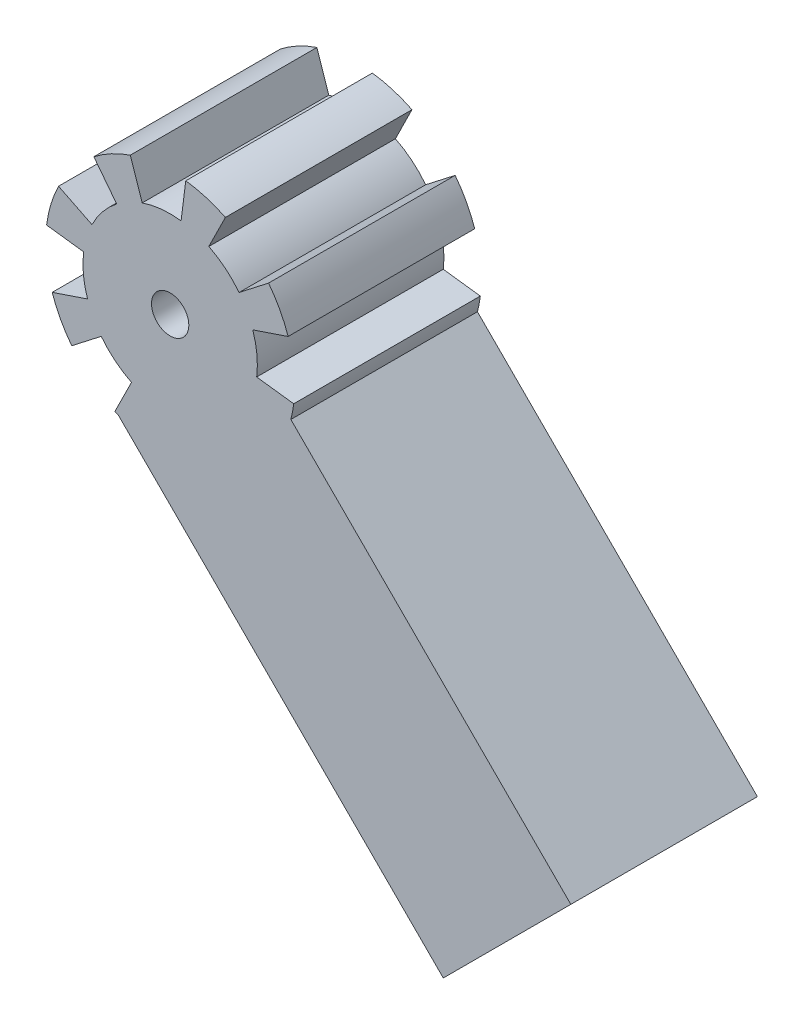
ISO-10303-21;
HEADER;
FILE_DESCRIPTION(('STEP AP214'),'2;1');
FILE_NAME('part.step','',(''),(''),'','','');
FILE_SCHEMA(('AUTOMOTIVE_DESIGN { 1 0 10303 214 1 1 1 1 }'));
ENDSEC;
DATA;
#1=APPLICATION_CONTEXT('core data for automotive mechanical design processes');
#2=APPLICATION_PROTOCOL_DEFINITION('international standard','automotive_design',2000,#1);
#3=PRODUCT_CONTEXT('',#1,'mechanical');
#4=PRODUCT('Part','Part','',(#3));
#5=PRODUCT_RELATED_PRODUCT_CATEGORY('part','',(#4));
#6=PRODUCT_DEFINITION_FORMATION('','',#4);
#7=PRODUCT_DEFINITION_CONTEXT('part definition',#1,'design');
#8=PRODUCT_DEFINITION('design','',#6,#7);
#9=PRODUCT_DEFINITION_SHAPE('','',#8);
#10=(LENGTH_UNIT() NAMED_UNIT(*) SI_UNIT(.MILLI.,.METRE.));
#11=(NAMED_UNIT(*) PLANE_ANGLE_UNIT() SI_UNIT($,.RADIAN.));
#12=(NAMED_UNIT(*) SI_UNIT($,.STERADIAN.) SOLID_ANGLE_UNIT());
#13=UNCERTAINTY_MEASURE_WITH_UNIT(LENGTH_MEASURE(1.E-05),#10,'distance_accuracy_value','');
#14=(GEOMETRIC_REPRESENTATION_CONTEXT(3) GLOBAL_UNCERTAINTY_ASSIGNED_CONTEXT((#13)) GLOBAL_UNIT_ASSIGNED_CONTEXT((#10,
#11,#12)) REPRESENTATION_CONTEXT('',''));
#15=CARTESIAN_POINT('',(0.,0.,0.));
#16=DIRECTION('',(0.,0.,1.));
#17=DIRECTION('',(1.,0.,0.));
#18=AXIS2_PLACEMENT_3D('',#15,#16,#17);
#19=CARTESIAN_POINT('',(-60.6023626185758,34.350667157932,20.));
#20=DIRECTION('',(0.,0.,-1.));
#21=DIRECTION('',(-1.,0.,0.));
#22=AXIS2_PLACEMENT_3D('',#19,#20,#21);
#23=CYLINDRICAL_SURFACE('',#22,13.3482298663582);
#24=DIRECTION('',(0.,0.,-1.));
#25=VECTOR('',#24,1.);
#26=CARTESIAN_POINT('',(-71.1495577414688,26.1694743595218,130.932125188069));
#27=LINE('',#26,#25);
#28=CARTESIAN_POINT('',(-71.1495577414688,26.1694743595218,20.));
#29=VERTEX_POINT('',#28);
#30=CARTESIAN_POINT('',(-71.1495577414688,26.1694743595218,0.));
#31=VERTEX_POINT('',#30);
#32=EDGE_CURVE('E50',#29,#31,#27,.T.);
#33=ORIENTED_EDGE('',*,*,#32,.F.);
#34=CARTESIAN_POINT('',(-60.6023626185758,34.350667157932,20.));
#35=DIRECTION('',(0.,0.,1.));
#36=DIRECTION('',(1.,0.,0.));
#37=AXIS2_PLACEMENT_3D('',#34,#35,#36);
#38=CIRCLE('',#37,13.3482298663582);
#39=CARTESIAN_POINT('',(-73.2476884215612,30.0762109467296,20.));
#40=VERTEX_POINT('',#39);
#41=EDGE_CURVE('E242',#40,#29,#38,.T.);
#42=ORIENTED_EDGE('',*,*,#41,.F.);
#43=DIRECTION('',(0.,0.,-1.));
#44=VECTOR('',#43,1.);
#45=CARTESIAN_POINT('',(-73.2476884215612,30.0762109467296,131.019410858415));
#46=LINE('',#45,#44);
#47=CARTESIAN_POINT('',(-73.2476884215612,30.0762109467296,0.));
#48=VERTEX_POINT('',#47);
#49=EDGE_CURVE('E255',#40,#48,#46,.T.);
#50=ORIENTED_EDGE('',*,*,#49,.T.);
#51=CARTESIAN_POINT('',(-60.6023626185758,34.350667157932,0.));
#52=DIRECTION('',(0.,0.,1.));
#53=DIRECTION('',(1.,0.,0.));
#54=AXIS2_PLACEMENT_3D('',#51,#52,#53);
#55=CIRCLE('',#54,13.3482298663582);
#56=EDGE_CURVE('E463',#48,#31,#55,.T.);
#57=ORIENTED_EDGE('',*,*,#56,.T.);
#58=EDGE_LOOP('',(#33,#42,#50,#57));
#59=FACE_BOUND('',#58,.T.);
#60=ADVANCED_FACE('F35',(#59),#23,.T.);
#61=DIRECTION('',(0.,0.,-1.));
#62=VECTOR('',#61,1.);
#63=CARTESIAN_POINT('',(-73.8453327184215,36.0236834458769,131.019410858415));
#64=LINE('',#63,#62);
#65=CARTESIAN_POINT('',(-73.8453327184215,36.0236834458769,20.));
#66=VERTEX_POINT('',#65);
#67=CARTESIAN_POINT('',(-73.8453327184215,36.0236834458769,0.));
#68=VERTEX_POINT('',#67);
#69=EDGE_CURVE('E58',#66,#68,#64,.T.);
#70=ORIENTED_EDGE('',*,*,#69,.F.);
#71=CARTESIAN_POINT('',(-72.5664552170062,40.26976581071,20.));
#72=VERTEX_POINT('',#71);
#73=EDGE_CURVE('E351',#72,#66,#38,.T.);
#74=ORIENTED_EDGE('',*,*,#73,.F.);
#75=DIRECTION('',(0.,0.,-1.));
#76=VECTOR('',#75,1.);
#77=CARTESIAN_POINT('',(-72.5664552170062,40.26976581071,106.112845736607));
#78=LINE('',#77,#76);
#79=CARTESIAN_POINT('',(-72.5664552170062,40.26976581071,0.));
#80=VERTEX_POINT('',#79);
#81=EDGE_CURVE('E328',#72,#80,#78,.T.);
#82=ORIENTED_EDGE('',*,*,#81,.T.);
#83=EDGE_CURVE('E367',#80,#68,#55,.T.);
#84=ORIENTED_EDGE('',*,*,#83,.T.);
#85=EDGE_LOOP('',(#70,#74,#82,#84));
#86=FACE_BOUND('',#85,.T.);
#87=ADVANCED_FACE('F502',(#86),#23,.T.);
#88=DIRECTION('',(0.,0.,-1.));
#89=VECTOR('',#88,1.);
#90=CARTESIAN_POINT('',(-47.3593925187301,32.677650869987,131.112845736608));
#91=LINE('',#90,#89);
#92=CARTESIAN_POINT('',(-47.3593925187301,32.677650869987,20.));
#93=VERTEX_POINT('',#92);
#94=CARTESIAN_POINT('',(-47.3593925187301,32.677650869987,0.));
#95=VERTEX_POINT('',#94);
#96=EDGE_CURVE('E266',#93,#95,#91,.T.);
#97=ORIENTED_EDGE('',*,*,#96,.F.);
#98=CARTESIAN_POINT('',(-47.6643117264083,31.067059435195,20.));
#99=VERTEX_POINT('',#98);
#100=EDGE_CURVE('E346',#99,#93,#38,.T.);
#101=ORIENTED_EDGE('',*,*,#100,.F.);
#102=DIRECTION('',(0.,0.,-1.));
#103=VECTOR('',#102,1.);
#104=CARTESIAN_POINT('',(-47.6643117264083,31.067059435195,20.));
#105=LINE('',#104,#103);
#106=CARTESIAN_POINT('',(-47.6643117264083,31.067059435195,0.));
#107=VERTEX_POINT('',#106);
#108=EDGE_CURVE('E358',#99,#107,#105,.T.);
#109=ORIENTED_EDGE('',*,*,#108,.T.);
#110=EDGE_CURVE('E362',#107,#95,#55,.T.);
#111=ORIENTED_EDGE('',*,*,#110,.T.);
#112=EDGE_LOOP('',(#97,#101,#109,#111));
#113=FACE_BOUND('',#112,.T.);
#114=ADVANCED_FACE('F506',(#113),#23,.T.);
#115=CARTESIAN_POINT('',(-47.9570368155904,38.6251233691344,20.));
#116=VERTEX_POINT('',#115);
#117=CARTESIAN_POINT('',(-50.0551674956828,42.5318599563421,20.));
#118=VERTEX_POINT('',#117);
#119=EDGE_CURVE('E350',#116,#118,#38,.T.);
#120=ORIENTED_EDGE('',*,*,#119,.F.);
#121=DIRECTION('',(0.,0.,-1.));
#122=VECTOR('',#121,1.);
#123=CARTESIAN_POINT('',(-47.9570368155904,38.6251233691344,131.112845736608));
#124=LINE('',#123,#122);
#125=CARTESIAN_POINT('',(-47.9570368155904,38.6251233691344,0.));
#126=VERTEX_POINT('',#125);
#127=EDGE_CURVE('E272',#116,#126,#124,.T.);
#128=ORIENTED_EDGE('',*,*,#127,.T.);
#129=CARTESIAN_POINT('',(-50.0551674956828,42.5318599563421,0.));
#130=VERTEX_POINT('',#129);
#131=EDGE_CURVE('E366',#126,#130,#55,.T.);
#132=ORIENTED_EDGE('',*,*,#131,.T.);
#133=DIRECTION('',(0.,0.,-1.));
#134=VECTOR('',#133,1.);
#135=CARTESIAN_POINT('',(-50.0551674956828,42.5318599563421,131.112845736608));
#136=LINE('',#135,#134);
#137=EDGE_CURVE('E283',#118,#130,#136,.T.);
#138=ORIENTED_EDGE('',*,*,#137,.F.);
#139=EDGE_LOOP('',(#120,#128,#132,#138));
#140=FACE_BOUND('',#139,.T.);
#141=ADVANCED_FACE('F470',(#140),#23,.T.);
#142=CARTESIAN_POINT('',(-54.6832639657977,46.3147597563624,20.));
#143=VERTEX_POINT('',#142);
#144=CARTESIAN_POINT('',(-58.9293463306309,47.5936372577777,20.));
#145=VERTEX_POINT('',#144);
#146=EDGE_CURVE('E441',#143,#145,#38,.T.);
#147=ORIENTED_EDGE('',*,*,#146,.F.);
#148=DIRECTION('',(0.,0.,-1.));
#149=VECTOR('',#148,1.);
#150=CARTESIAN_POINT('',(-54.6832639657977,46.3147597563624,131.112845736608));
#151=LINE('',#150,#149);
#152=CARTESIAN_POINT('',(-54.6832639657977,46.3147597563624,0.));
#153=VERTEX_POINT('',#152);
#154=EDGE_CURVE('E290',#143,#153,#151,.T.);
#155=ORIENTED_EDGE('',*,*,#154,.T.);
#156=CARTESIAN_POINT('',(-58.9293463306309,47.5936372577777,0.));
#157=VERTEX_POINT('',#156);
#158=EDGE_CURVE('E461',#153,#157,#55,.T.);
#159=ORIENTED_EDGE('',*,*,#158,.T.);
#160=DIRECTION('',(0.,0.,-1.));
#161=VECTOR('',#160,1.);
#162=CARTESIAN_POINT('',(-58.9293463306309,47.5936372577777,131.112845736608));
#163=LINE('',#162,#161);
#164=EDGE_CURVE('E302',#145,#157,#163,.T.);
#165=ORIENTED_EDGE('',*,*,#164,.F.);
#166=EDGE_LOOP('',(#147,#155,#159,#165));
#167=FACE_BOUND('',#166,.T.);
#168=ADVANCED_FACE('F483',(#167),#23,.T.);
#169=CARTESIAN_POINT('',(-64.8768188297782,46.9959929609174,20.));
#170=VERTEX_POINT('',#169);
#171=CARTESIAN_POINT('',(-68.783555416986,44.897862280825,20.));
#172=VERTEX_POINT('',#171);
#173=EDGE_CURVE('E440',#170,#172,#38,.T.);
#174=ORIENTED_EDGE('',*,*,#173,.F.);
#175=DIRECTION('',(0.,0.,-1.));
#176=VECTOR('',#175,1.);
#177=CARTESIAN_POINT('',(-64.8768188297782,46.9959929609174,131.112845736608));
#178=LINE('',#177,#176);
#179=CARTESIAN_POINT('',(-64.8768188297782,46.9959929609174,0.));
#180=VERTEX_POINT('',#179);
#181=EDGE_CURVE('E309',#170,#180,#178,.T.);
#182=ORIENTED_EDGE('',*,*,#181,.T.);
#183=CARTESIAN_POINT('',(-68.783555416986,44.897862280825,0.));
#184=VERTEX_POINT('',#183);
#185=EDGE_CURVE('E460',#180,#184,#55,.T.);
#186=ORIENTED_EDGE('',*,*,#185,.T.);
#187=DIRECTION('',(0.,0.,-1.));
#188=VECTOR('',#187,1.);
#189=CARTESIAN_POINT('',(-68.783555416986,44.897862280825,106.112845736607));
#190=LINE('',#189,#188);
#191=EDGE_CURVE('E321',#172,#184,#190,.T.);
#192=ORIENTED_EDGE('',*,*,#191,.F.);
#193=EDGE_LOOP('',(#174,#182,#186,#192));
#194=FACE_BOUND('',#193,.T.);
#195=ADVANCED_FACE('F458',(#194),#23,.T.);
#196=CARTESIAN_POINT('',(-66.5214612713538,22.3865745595016,20.));
#197=VERTEX_POINT('',#196);
#198=CARTESIAN_POINT('',(-66.1374973389379,22.2041646081205,20.));
#199=VERTEX_POINT('',#198);
#200=EDGE_CURVE('E344',#197,#199,#38,.T.);
#201=ORIENTED_EDGE('',*,*,#200,.F.);
#202=DIRECTION('',(0.,0.,-1.));
#203=VECTOR('',#202,1.);
#204=CARTESIAN_POINT('',(-66.5214612713538,22.3865745595016,130.932125188069));
#205=LINE('',#204,#203);
#206=CARTESIAN_POINT('',(-66.5214612713538,22.3865745595016,0.));
#207=VERTEX_POINT('',#206);
#208=EDGE_CURVE('E243',#197,#207,#205,.T.);
#209=ORIENTED_EDGE('',*,*,#208,.T.);
#210=CARTESIAN_POINT('',(-66.1374973389379,22.2041646081205,0.));
#211=VERTEX_POINT('',#210);
#212=EDGE_CURVE('E361',#207,#211,#55,.T.);
#213=ORIENTED_EDGE('',*,*,#212,.T.);
#214=DIRECTION('',(0.,0.,-1.));
#215=VECTOR('',#214,1.);
#216=CARTESIAN_POINT('',(-66.1374973389379,22.2041646081205,20.));
#217=LINE('',#216,#215);
#218=EDGE_CURVE('E380',#199,#211,#217,.T.);
#219=ORIENTED_EDGE('',*,*,#218,.F.);
#220=EDGE_LOOP('',(#201,#209,#213,#219));
#221=FACE_BOUND('',#220,.T.);
#222=ADVANCED_FACE('F438',(#221),#23,.T.);
#223=CARTESIAN_POINT('',(-21.9666663654087,-21.9666663654087,20.));
#224=DIRECTION('',(-0.707106781186548,-0.707106781186547,0.));
#225=DIRECTION('',(0.707106781186547,-0.707106781186548,0.));
#226=AXIS2_PLACEMENT_3D('',#223,#224,#225);
#227=PLANE('',#226);
#228=DIRECTION('',(-0.707106781186547,0.707106781186548,0.));
#229=VECTOR('',#228,1.);
#230=CARTESIAN_POINT('',(-21.9666663654087,-21.9666663654087,0.));
#231=LINE('',#230,#229);
#232=CARTESIAN_POINT('',(-31.3231817931972,-12.6101509376202,0.));
#233=VERTEX_POINT('',#232);
#234=EDGE_CURVE('E365',#233,#211,#231,.T.);
#235=ORIENTED_EDGE('',*,*,#234,.F.);
#236=DIRECTION('',(0.,0.,-1.));
#237=VECTOR('',#236,1.);
#238=CARTESIAN_POINT('',(-31.3231817931972,-12.6101509376202,20.));
#239=LINE('',#238,#237);
#240=CARTESIAN_POINT('',(-31.3231817931972,-12.6101509376202,20.));
#241=VERTEX_POINT('',#240);
#242=EDGE_CURVE('E378',#241,#233,#239,.T.);
#243=ORIENTED_EDGE('',*,*,#242,.F.);
#244=DIRECTION('',(-0.707106781186547,0.707106781186548,0.));
#245=VECTOR('',#244,1.);
#246=CARTESIAN_POINT('',(-21.9666663654087,-21.9666663654087,20.));
#247=LINE('',#246,#245);
#248=EDGE_CURVE('E349',#241,#199,#247,.T.);
#249=ORIENTED_EDGE('',*,*,#248,.T.);
#250=ORIENTED_EDGE('',*,*,#218,.T.);
#251=EDGE_LOOP('',(#235,#243,#249,#250));
#252=FACE_BOUND('',#251,.T.);
#253=ADVANCED_FACE('F509',(#252),#227,.T.);
#254=CARTESIAN_POINT('',(-9.35651542778853,9.35651542778853,20.));
#255=DIRECTION('',(-0.707106781186548,0.707106781186548,0.));
#256=DIRECTION('',(-0.707106781186548,-0.707106781186548,0.));
#257=AXIS2_PLACEMENT_3D('',#254,#255,#256);
#258=PLANE('',#257);
#259=DIRECTION('',(0.707106781186548,0.707106781186548,0.));
#260=VECTOR('',#259,1.);
#261=CARTESIAN_POINT('',(-9.35651542778853,9.35651542778853,0.));
#262=LINE('',#261,#260);
#263=CARTESIAN_POINT('',(-17.6551415733952,1.05788928218188,0.));
#264=VERTEX_POINT('',#263);
#265=EDGE_CURVE('E370',#233,#264,#262,.T.);
#266=ORIENTED_EDGE('',*,*,#265,.T.);
#267=DIRECTION('',(0.,0.,-1.));
#268=VECTOR('',#267,1.);
#269=CARTESIAN_POINT('',(-17.6551415733952,1.05788928218188,20.));
#270=LINE('',#269,#268);
#271=CARTESIAN_POINT('',(-17.6551415733952,1.05788928218188,20.));
#272=VERTEX_POINT('',#271);
#273=EDGE_CURVE('E375',#272,#264,#270,.T.);
#274=ORIENTED_EDGE('',*,*,#273,.F.);
#275=DIRECTION('',(0.707106781186548,0.707106781186548,0.));
#276=VECTOR('',#275,1.);
#277=CARTESIAN_POINT('',(-9.35651542778853,9.35651542778853,20.));
#278=LINE('',#277,#276);
#279=EDGE_CURVE('E354',#241,#272,#278,.T.);
#280=ORIENTED_EDGE('',*,*,#279,.F.);
#281=ORIENTED_EDGE('',*,*,#242,.T.);
#282=EDGE_LOOP('',(#266,#274,#280,#281));
#283=FACE_BOUND('',#282,.T.);
#284=ADVANCED_FACE('F514',(#283),#258,.F.);
#285=CARTESIAN_POINT('',(-60.6023626185758,34.350667157932,20.));
#286=DIRECTION('',(0.,0.,-1.));
#287=DIRECTION('',(-1.,0.,0.));
#288=AXIS2_PLACEMENT_3D('',#285,#286,#287);
#289=CYLINDRICAL_SURFACE('',#288,2.);
#290=CARTESIAN_POINT('',(-60.6023626185758,34.350667157932,20.));
#291=DIRECTION('',(0.,0.,1.));
#292=DIRECTION('',(1.,0.,0.));
#293=AXIS2_PLACEMENT_3D('',#290,#291,#292);
#294=CIRCLE('',#293,2.);
#295=CARTESIAN_POINT('',(-58.6023626185758,34.350667157932,20.));
#296=VERTEX_POINT('',#295);
#297=EDGE_CURVE('E341',#296,#296,#294,.T.);
#298=ORIENTED_EDGE('',*,*,#297,.T.);
#299=EDGE_LOOP('',(#298));
#300=FACE_BOUND('',#299,.T.);
#301=CARTESIAN_POINT('',(-60.6023626185758,34.350667157932,0.));
#302=DIRECTION('',(0.,0.,1.));
#303=DIRECTION('',(1.,0.,0.));
#304=AXIS2_PLACEMENT_3D('',#301,#302,#303);
#305=CIRCLE('',#304,2.);
#306=CARTESIAN_POINT('',(-58.6023626185758,34.350667157932,0.));
#307=VERTEX_POINT('',#306);
#308=EDGE_CURVE('E340',#307,#307,#305,.T.);
#309=ORIENTED_EDGE('',*,*,#308,.F.);
#310=EDGE_LOOP('',(#309));
#311=FACE_BOUND('',#310,.T.);
#312=ADVANCED_FACE('F37',(#300,#311),#289,.F.);
#313=CARTESIAN_POINT('',(-8.29862614560665,-8.29862614560665,20.));
#314=DIRECTION('',(-0.707106781186548,-0.707106781186547,0.));
#315=DIRECTION('',(0.707106781186547,-0.707106781186548,0.));
#316=AXIS2_PLACEMENT_3D('',#313,#314,#315);
#317=PLANE('',#316);
#318=DIRECTION('',(-0.707106781186547,0.707106781186548,0.));
#319=VECTOR('',#318,1.);
#320=CARTESIAN_POINT('',(-8.29862614560665,-8.29862614560665,0.));
#321=LINE('',#320,#319);
#322=EDGE_CURVE('E345',#264,#107,#321,.T.);
#323=ORIENTED_EDGE('',*,*,#322,.T.);
#324=ORIENTED_EDGE('',*,*,#108,.F.);
#325=DIRECTION('',(-0.707106781186547,0.707106781186548,0.));
#326=VECTOR('',#325,1.);
#327=CARTESIAN_POINT('',(-8.29862614560665,-8.29862614560665,20.));
#328=LINE('',#327,#326);
#329=EDGE_CURVE('E356',#272,#99,#328,.T.);
#330=ORIENTED_EDGE('',*,*,#329,.F.);
#331=ORIENTED_EDGE('',*,*,#273,.T.);
#332=EDGE_LOOP('',(#323,#324,#330,#331));
#333=FACE_BOUND('',#332,.T.);
#334=ADVANCED_FACE('F539',(#333),#317,.F.);
#335=CARTESIAN_POINT('',(0.,0.,20.));
#336=DIRECTION('',(0.,0.,1.));
#337=DIRECTION('',(1.,0.,0.));
#338=AXIS2_PLACEMENT_3D('',#335,#336,#337);
#339=PLANE('',#338);
#340=DIRECTION('',(0.443436973444398,0.896305556483096,0.));
#341=VECTOR('',#340,1.);
#342=CARTESIAN_POINT('',(-62.338580481031,30.8413032334579,20.));
#343=LINE('',#342,#341);
#344=CARTESIAN_POINT('',(-64.7477133775762,25.971796785434,20.));
#345=VERTEX_POINT('',#344);
#346=EDGE_CURVE('E231',#197,#345,#343,.T.);
#347=ORIENTED_EDGE('',*,*,#346,.F.);
#348=ORIENTED_EDGE('',*,*,#200,.T.);
#349=ORIENTED_EDGE('',*,*,#248,.F.);
#350=ORIENTED_EDGE('',*,*,#279,.T.);
#351=ORIENTED_EDGE('',*,*,#329,.T.);
#352=ORIENTED_EDGE('',*,*,#100,.T.);
#353=DIRECTION('',(0.992114327699902,-0.12533619099275,0.));
#354=VECTOR('',#353,1.);
#355=CARTESIAN_POINT('',(3.31941869222108,26.2752746680956,20.));
#356=LINE('',#355,#354);
#357=CARTESIAN_POINT('',(-51.3278498295298,33.178995633958,20.));
#358=VERTEX_POINT('',#357);
#359=EDGE_CURVE('E275',#358,#93,#356,.T.);
#360=ORIENTED_EDGE('',*,*,#359,.F.);
#361=CARTESIAN_POINT('',(-60.6023626185758,34.350667157932,20.));
#362=DIRECTION('',(0.,0.,1.));
#363=DIRECTION('',(1.,0.,0.));
#364=AXIS2_PLACEMENT_3D('',#361,#362,#363);
#365=CIRCLE('',#364,9.34822986635814);
#366=CARTESIAN_POINT('',(-51.7464009274134,37.3442175849224,20.));
#367=VERTEX_POINT('',#366);
#368=EDGE_CURVE('E279',#367,#358,#365,.F.);
#369=ORIENTED_EDGE('',*,*,#368,.F.);
#370=DIRECTION('',(-0.947341027955755,-0.320226446052998,0.));
#371=VECTOR('',#370,1.);
#372=CARTESIAN_POINT('',(-16.6352116547955,49.2127327507088,20.));
#373=LINE('',#372,#371);
#374=EDGE_CURVE('E281',#116,#367,#373,.T.);
#375=ORIENTED_EDGE('',*,*,#374,.F.);
#376=ORIENTED_EDGE('',*,*,#119,.T.);
#377=DIRECTION('',(0.790156839407998,0.612904698249869,0.));
#378=VECTOR('',#377,1.);
#379=CARTESIAN_POINT('',(-39.4011223984177,50.795933580475,20.));
#380=LINE('',#379,#378);
#381=CARTESIAN_POINT('',(-53.2157948533148,40.0802411633427,20.));
#382=VERTEX_POINT('',#381);
#383=EDGE_CURVE('E293',#382,#118,#380,.T.);
#384=ORIENTED_EDGE('',*,*,#383,.F.);
#385=CARTESIAN_POINT('',(-60.6023626185758,34.350667157932,20.));
#386=DIRECTION('',(0.,0.,1.));
#387=DIRECTION('',(1.,0.,0.));
#388=AXIS2_PLACEMENT_3D('',#385,#386,#387);
#389=CIRCLE('',#388,9.34822986635814);
#390=CARTESIAN_POINT('',(-56.4570118595754,42.72953753043,20.));
#391=VERTEX_POINT('',#390);
#392=EDGE_CURVE('E298',#391,#382,#389,.F.);
#393=ORIENTED_EDGE('',*,*,#392,.F.);
#394=DIRECTION('',(-0.443436973444404,-0.896305556483093,0.));
#395=VECTOR('',#394,1.);
#396=CARTESIAN_POINT('',(-62.3385804810308,30.8413032334583,20.));
#397=LINE('',#396,#395);
#398=EDGE_CURVE('E300',#143,#391,#397,.T.);
#399=ORIENTED_EDGE('',*,*,#398,.F.);
#400=ORIENTED_EDGE('',*,*,#146,.T.);
#401=DIRECTION('',(0.125336190992747,0.992114327699903,0.));
#402=VECTOR('',#401,1.);
#403=CARTESIAN_POINT('',(-63.9217813107968,8.07539248983613,20.));
#404=LINE('',#403,#402);
#405=CARTESIAN_POINT('',(-59.4306910946019,43.6251799469781,20.));
#406=VERTEX_POINT('',#405);
#407=EDGE_CURVE('E312',#406,#145,#404,.T.);
#408=ORIENTED_EDGE('',*,*,#407,.F.);
#409=CARTESIAN_POINT('',(-60.6023626185758,34.350667157932,20.));
#410=DIRECTION('',(0.,0.,1.));
#411=DIRECTION('',(1.,0.,0.));
#412=AXIS2_PLACEMENT_3D('',#409,#410,#411);
#413=CIRCLE('',#412,9.34822986635814);
#414=CARTESIAN_POINT('',(-63.5959130455662,43.2066288490944,20.));
#415=VERTEX_POINT('',#414);
#416=EDGE_CURVE('E317',#415,#406,#413,.F.);
#417=ORIENTED_EDGE('',*,*,#416,.F.);
#418=DIRECTION('',(0.320226446053002,-0.947341027955754,0.));
#419=VECTOR('',#418,1.);
#420=CARTESIAN_POINT('',(-43.9671509637801,-14.8620655927769,20.));
#421=LINE('',#420,#419);
#422=EDGE_CURVE('E319',#170,#415,#421,.T.);
#423=ORIENTED_EDGE('',*,*,#422,.F.);
#424=ORIENTED_EDGE('',*,*,#173,.T.);
#425=DIRECTION('',(-0.612904698249872,0.790156839407996,0.));
#426=VECTOR('',#425,1.);
#427=CARTESIAN_POINT('',(-21.2012402201579,-16.4452664225429,20.));
#428=LINE('',#427,#426);
#429=CARTESIAN_POINT('',(-66.3319366239865,41.737234923193,20.));
#430=VERTEX_POINT('',#429);
#431=EDGE_CURVE('E331',#430,#172,#428,.T.);
#432=ORIENTED_EDGE('',*,*,#431,.F.);
#433=CARTESIAN_POINT('',(-60.6023626185758,34.350667157932,20.));
#434=DIRECTION('',(0.,0.,1.));
#435=DIRECTION('',(1.,0.,0.));
#436=AXIS2_PLACEMENT_3D('',#433,#434,#435);
#437=CIRCLE('',#436,9.34822986635814);
#438=CARTESIAN_POINT('',(-68.9812329910738,38.4960179169324,20.));
#439=VERTEX_POINT('',#438);
#440=EDGE_CURVE('E336',#439,#430,#437,.F.);
#441=ORIENTED_EDGE('',*,*,#440,.F.);
#442=DIRECTION('',(0.896305556483095,-0.443436973444401,0.));
#443=VECTOR('',#442,1.);
#444=CARTESIAN_POINT('',(1.73621786245506,3.5093639244739,20.));
#445=LINE('',#444,#443);
#446=EDGE_CURVE('E338',#72,#439,#445,.T.);
#447=ORIENTED_EDGE('',*,*,#446,.F.);
#448=ORIENTED_EDGE('',*,*,#73,.T.);
#449=DIRECTION('',(-0.992114327699903,0.125336190992743,0.));
#450=VECTOR('',#449,1.);
#451=CARTESIAN_POINT('',(3.31941869222095,26.2752746680961,20.));
#452=LINE('',#451,#450);
#453=CARTESIAN_POINT('',(-69.8768754076219,35.522338681906,20.));
#454=VERTEX_POINT('',#453);
#455=EDGE_CURVE('E258',#454,#66,#452,.T.);
#456=ORIENTED_EDGE('',*,*,#455,.F.);
#457=CARTESIAN_POINT('',(-60.6023626185758,34.350667157932,20.));
#458=DIRECTION('',(0.,0.,1.));
#459=DIRECTION('',(1.,0.,0.));
#460=AXIS2_PLACEMENT_3D('',#457,#458,#459);
#461=CIRCLE('',#460,9.34822986635814);
#462=CARTESIAN_POINT('',(-69.4583243097382,31.3571167309416,20.));
#463=VERTEX_POINT('',#462);
#464=EDGE_CURVE('E262',#463,#454,#461,.F.);
#465=ORIENTED_EDGE('',*,*,#464,.F.);
#466=DIRECTION('',(0.947341027955753,0.320226446053005,0.));
#467=VECTOR('',#466,1.);
#468=CARTESIAN_POINT('',(-16.6352116547959,49.212732750709,20.));
#469=LINE('',#468,#467);
#470=EDGE_CURVE('E264',#40,#463,#469,.T.);
#471=ORIENTED_EDGE('',*,*,#470,.F.);
#472=ORIENTED_EDGE('',*,*,#41,.T.);
#473=DIRECTION('',(-0.790156839407994,-0.612904698249874,0.));
#474=VECTOR('',#473,1.);
#475=CARTESIAN_POINT('',(-39.4011223984182,50.7959335804749,20.));
#476=LINE('',#475,#474);
#477=CARTESIAN_POINT('',(-67.9889303838368,28.6210931525213,20.));
#478=VERTEX_POINT('',#477);
#479=EDGE_CURVE('E232',#478,#29,#476,.T.);
#480=ORIENTED_EDGE('',*,*,#479,.F.);
#481=CARTESIAN_POINT('',(-60.6023626185758,34.350667157932,20.));
#482=DIRECTION('',(0.,0.,1.));
#483=DIRECTION('',(1.,0.,0.));
#484=AXIS2_PLACEMENT_3D('',#481,#482,#483);
#485=CIRCLE('',#484,9.34822986635814);
#486=EDGE_CURVE('E221',#345,#478,#485,.F.);
#487=ORIENTED_EDGE('',*,*,#486,.F.);
#488=EDGE_LOOP('',(#347,#348,#349,#350,#351,#352,#360,#369,#375,#376,#384,#393,#399,#400,#408,
#417,#423,#424,#432,#441,#447,#448,#456,#465,#471,#472,#480,#487));
#489=FACE_BOUND('',#488,.T.);
#490=ORIENTED_EDGE('',*,*,#297,.F.);
#491=EDGE_LOOP('',(#490));
#492=FACE_BOUND('',#491,.T.);
#493=ADVANCED_FACE('F238',(#489,#492),#339,.T.);
#494=CARTESIAN_POINT('',(0.,0.,0.));
#495=DIRECTION('',(0.,0.,1.));
#496=DIRECTION('',(1.,0.,0.));
#497=AXIS2_PLACEMENT_3D('',#494,#495,#496);
#498=PLANE('',#497);
#499=ORIENTED_EDGE('',*,*,#308,.T.);
#500=EDGE_LOOP('',(#499));
#501=FACE_BOUND('',#500,.T.);
#502=ORIENTED_EDGE('',*,*,#212,.F.);
#503=DIRECTION('',(0.443436973444398,0.896305556483096,0.));
#504=VECTOR('',#503,1.);
#505=CARTESIAN_POINT('',(-62.338580481031,30.8413032334579,0.));
#506=LINE('',#505,#504);
#507=CARTESIAN_POINT('',(-64.7477133775762,25.971796785434,0.));
#508=VERTEX_POINT('',#507);
#509=EDGE_CURVE('E11',#207,#508,#506,.T.);
#510=ORIENTED_EDGE('',*,*,#509,.T.);
#511=CARTESIAN_POINT('',(-60.6023626185758,34.350667157932,0.));
#512=DIRECTION('',(0.,0.,1.));
#513=DIRECTION('',(1.,0.,0.));
#514=AXIS2_PLACEMENT_3D('',#511,#512,#513);
#515=CIRCLE('',#514,9.34822986635814);
#516=CARTESIAN_POINT('',(-67.9889303838368,28.6210931525213,0.));
#517=VERTEX_POINT('',#516);
#518=EDGE_CURVE('E43',#508,#517,#515,.F.);
#519=ORIENTED_EDGE('',*,*,#518,.T.);
#520=DIRECTION('',(-0.790156839407994,-0.612904698249874,0.));
#521=VECTOR('',#520,1.);
#522=CARTESIAN_POINT('',(-39.4011223984182,50.7959335804749,0.));
#523=LINE('',#522,#521);
#524=EDGE_CURVE('E235',#517,#31,#523,.T.);
#525=ORIENTED_EDGE('',*,*,#524,.T.);
#526=ORIENTED_EDGE('',*,*,#56,.F.);
#527=DIRECTION('',(0.947341027955753,0.320226446053005,0.));
#528=VECTOR('',#527,1.);
#529=CARTESIAN_POINT('',(-16.6352116547959,49.212732750709,0.));
#530=LINE('',#529,#528);
#531=CARTESIAN_POINT('',(-69.4583243097382,31.3571167309416,0.));
#532=VERTEX_POINT('',#531);
#533=EDGE_CURVE('E424',#48,#532,#530,.T.);
#534=ORIENTED_EDGE('',*,*,#533,.T.);
#535=CARTESIAN_POINT('',(-60.6023626185758,34.350667157932,0.));
#536=DIRECTION('',(0.,0.,1.));
#537=DIRECTION('',(1.,0.,0.));
#538=AXIS2_PLACEMENT_3D('',#535,#536,#537);
#539=CIRCLE('',#538,9.34822986635814);
#540=CARTESIAN_POINT('',(-69.8768754076219,35.522338681906,0.));
#541=VERTEX_POINT('',#540);
#542=EDGE_CURVE('E421',#532,#541,#539,.F.);
#543=ORIENTED_EDGE('',*,*,#542,.T.);
#544=DIRECTION('',(-0.992114327699903,0.125336190992743,0.));
#545=VECTOR('',#544,1.);
#546=CARTESIAN_POINT('',(3.31941869222095,26.2752746680961,0.));
#547=LINE('',#546,#545);
#548=EDGE_CURVE('E419',#541,#68,#547,.T.);
#549=ORIENTED_EDGE('',*,*,#548,.T.);
#550=ORIENTED_EDGE('',*,*,#83,.F.);
#551=DIRECTION('',(0.896305556483095,-0.443436973444401,0.));
#552=VECTOR('',#551,1.);
#553=CARTESIAN_POINT('',(1.73621786245506,3.5093639244739,0.));
#554=LINE('',#553,#552);
#555=CARTESIAN_POINT('',(-68.9812329910738,38.4960179169324,0.));
#556=VERTEX_POINT('',#555);
#557=EDGE_CURVE('E389',#80,#556,#554,.T.);
#558=ORIENTED_EDGE('',*,*,#557,.T.);
#559=CARTESIAN_POINT('',(-60.6023626185758,34.350667157932,0.));
#560=DIRECTION('',(0.,0.,1.));
#561=DIRECTION('',(1.,0.,0.));
#562=AXIS2_PLACEMENT_3D('',#559,#560,#561);
#563=CIRCLE('',#562,9.34822986635814);
#564=CARTESIAN_POINT('',(-66.3319366239865,41.737234923193,0.));
#565=VERTEX_POINT('',#564);
#566=EDGE_CURVE('E386',#556,#565,#563,.F.);
#567=ORIENTED_EDGE('',*,*,#566,.T.);
#568=DIRECTION('',(-0.612904698249872,0.790156839407996,0.));
#569=VECTOR('',#568,1.);
#570=CARTESIAN_POINT('',(-21.2012402201579,-16.4452664225429,0.));
#571=LINE('',#570,#569);
#572=EDGE_CURVE('E383',#565,#184,#571,.T.);
#573=ORIENTED_EDGE('',*,*,#572,.T.);
#574=ORIENTED_EDGE('',*,*,#185,.F.);
#575=DIRECTION('',(0.320226446053002,-0.947341027955754,0.));
#576=VECTOR('',#575,1.);
#577=CARTESIAN_POINT('',(-43.9671509637801,-14.8620655927769,0.));
#578=LINE('',#577,#576);
#579=CARTESIAN_POINT('',(-63.5959130455662,43.2066288490944,0.));
#580=VERTEX_POINT('',#579);
#581=EDGE_CURVE('E398',#180,#580,#578,.T.);
#582=ORIENTED_EDGE('',*,*,#581,.T.);
#583=CARTESIAN_POINT('',(-60.6023626185758,34.350667157932,0.));
#584=DIRECTION('',(0.,0.,1.));
#585=DIRECTION('',(1.,0.,0.));
#586=AXIS2_PLACEMENT_3D('',#583,#584,#585);
#587=CIRCLE('',#586,9.34822986635814);
#588=CARTESIAN_POINT('',(-59.4306910946019,43.6251799469781,0.));
#589=VERTEX_POINT('',#588);
#590=EDGE_CURVE('E395',#580,#589,#587,.F.);
#591=ORIENTED_EDGE('',*,*,#590,.T.);
#592=DIRECTION('',(0.125336190992747,0.992114327699903,0.));
#593=VECTOR('',#592,1.);
#594=CARTESIAN_POINT('',(-63.9217813107968,8.07539248983613,0.));
#595=LINE('',#594,#593);
#596=EDGE_CURVE('E392',#589,#157,#595,.T.);
#597=ORIENTED_EDGE('',*,*,#596,.T.);
#598=ORIENTED_EDGE('',*,*,#158,.F.);
#599=DIRECTION('',(-0.443436973444404,-0.896305556483093,0.));
#600=VECTOR('',#599,1.);
#601=CARTESIAN_POINT('',(-62.3385804810308,30.8413032334583,0.));
#602=LINE('',#601,#600);
#603=CARTESIAN_POINT('',(-56.4570118595754,42.72953753043,0.));
#604=VERTEX_POINT('',#603);
#605=EDGE_CURVE('E407',#153,#604,#602,.T.);
#606=ORIENTED_EDGE('',*,*,#605,.T.);
#607=CARTESIAN_POINT('',(-60.6023626185758,34.350667157932,0.));
#608=DIRECTION('',(0.,0.,1.));
#609=DIRECTION('',(1.,0.,0.));
#610=AXIS2_PLACEMENT_3D('',#607,#608,#609);
#611=CIRCLE('',#610,9.34822986635814);
#612=CARTESIAN_POINT('',(-53.2157948533148,40.0802411633427,0.));
#613=VERTEX_POINT('',#612);
#614=EDGE_CURVE('E404',#604,#613,#611,.F.);
#615=ORIENTED_EDGE('',*,*,#614,.T.);
#616=DIRECTION('',(0.790156839407998,0.612904698249869,0.));
#617=VECTOR('',#616,1.);
#618=CARTESIAN_POINT('',(-39.4011223984177,50.795933580475,0.));
#619=LINE('',#618,#617);
#620=EDGE_CURVE('E401',#613,#130,#619,.T.);
#621=ORIENTED_EDGE('',*,*,#620,.T.);
#622=ORIENTED_EDGE('',*,*,#131,.F.);
#623=DIRECTION('',(-0.947341027955755,-0.320226446052998,0.));
#624=VECTOR('',#623,1.);
#625=CARTESIAN_POINT('',(-16.6352116547955,49.2127327507088,0.));
#626=LINE('',#625,#624);
#627=CARTESIAN_POINT('',(-51.7464009274134,37.3442175849224,0.));
#628=VERTEX_POINT('',#627);
#629=EDGE_CURVE('E416',#126,#628,#626,.T.);
#630=ORIENTED_EDGE('',*,*,#629,.T.);
#631=CARTESIAN_POINT('',(-60.6023626185758,34.350667157932,0.));
#632=DIRECTION('',(0.,0.,1.));
#633=DIRECTION('',(1.,0.,0.));
#634=AXIS2_PLACEMENT_3D('',#631,#632,#633);
#635=CIRCLE('',#634,9.34822986635814);
#636=CARTESIAN_POINT('',(-51.3278498295298,33.178995633958,0.));
#637=VERTEX_POINT('',#636);
#638=EDGE_CURVE('E413',#628,#637,#635,.F.);
#639=ORIENTED_EDGE('',*,*,#638,.T.);
#640=DIRECTION('',(0.992114327699902,-0.12533619099275,0.));
#641=VECTOR('',#640,1.);
#642=CARTESIAN_POINT('',(3.31941869222108,26.2752746680956,0.));
#643=LINE('',#642,#641);
#644=EDGE_CURVE('E410',#637,#95,#643,.T.);
#645=ORIENTED_EDGE('',*,*,#644,.T.);
#646=ORIENTED_EDGE('',*,*,#110,.F.);
#647=ORIENTED_EDGE('',*,*,#322,.F.);
#648=ORIENTED_EDGE('',*,*,#265,.F.);
#649=ORIENTED_EDGE('',*,*,#234,.T.);
#650=EDGE_LOOP('',(#502,#510,#519,#525,#526,#534,#543,#549,#550,#558,#567,#573,#574,#582,#591,
#597,#598,#606,#615,#621,#622,#630,#639,#645,#646,#647,#648,#649));
#651=FACE_BOUND('',#650,.T.);
#652=ADVANCED_FACE('F429',(#501,#651),#498,.F.);
#653=CARTESIAN_POINT('',(-68.9812329910738,38.4960179169324,106.112845736607));
#654=DIRECTION('',(-0.443436973444401,-0.896305556483094,0.));
#655=DIRECTION('',(0.896305556483095,-0.443436973444401,0.));
#656=AXIS2_PLACEMENT_3D('',#653,#654,#655);
#657=PLANE('',#656);
#658=ORIENTED_EDGE('',*,*,#81,.F.);
#659=ORIENTED_EDGE('',*,*,#446,.T.);
#660=DIRECTION('',(0.,0.,-1.));
#661=VECTOR('',#660,1.);
#662=CARTESIAN_POINT('',(-68.9812329910738,38.4960179169324,106.112845736607));
#663=LINE('',#662,#661);
#664=EDGE_CURVE('E327',#439,#556,#663,.T.);
#665=ORIENTED_EDGE('',*,*,#664,.T.);
#666=ORIENTED_EDGE('',*,*,#557,.F.);
#667=EDGE_LOOP('',(#658,#659,#665,#666));
#668=FACE_BOUND('',#667,.T.);
#669=ADVANCED_FACE('F635',(#668),#657,.F.);
#670=CARTESIAN_POINT('',(-60.6023626185758,34.350667157932,106.112845736607));
#671=DIRECTION('',(0.,0.,-1.));
#672=DIRECTION('',(-1.,0.,0.));
#673=AXIS2_PLACEMENT_3D('',#670,#671,#672);
#674=CYLINDRICAL_SURFACE('',#673,9.34822986635814);
#675=ORIENTED_EDGE('',*,*,#664,.F.);
#676=ORIENTED_EDGE('',*,*,#440,.T.);
#677=DIRECTION('',(0.,0.,-1.));
#678=VECTOR('',#677,1.);
#679=CARTESIAN_POINT('',(-66.3319366239865,41.737234923193,106.112845736607));
#680=LINE('',#679,#678);
#681=EDGE_CURVE('E324',#430,#565,#680,.T.);
#682=ORIENTED_EDGE('',*,*,#681,.T.);
#683=ORIENTED_EDGE('',*,*,#566,.F.);
#684=EDGE_LOOP('',(#675,#676,#682,#683));
#685=FACE_BOUND('',#684,.T.);
#686=ADVANCED_FACE('F499',(#685),#674,.T.);
#687=CARTESIAN_POINT('',(-66.3319366239865,41.737234923193,106.112845736607));
#688=DIRECTION('',(0.790156839407996,0.612904698249872,0.));
#689=DIRECTION('',(-0.612904698249872,0.790156839407996,0.));
#690=AXIS2_PLACEMENT_3D('',#687,#688,#689);
#691=PLANE('',#690);
#692=ORIENTED_EDGE('',*,*,#681,.F.);
#693=ORIENTED_EDGE('',*,*,#431,.T.);
#694=ORIENTED_EDGE('',*,*,#191,.T.);
#695=ORIENTED_EDGE('',*,*,#572,.F.);
#696=EDGE_LOOP('',(#692,#693,#694,#695));
#697=FACE_BOUND('',#696,.T.);
#698=ADVANCED_FACE('F457',(#697),#691,.F.);
#699=CARTESIAN_POINT('',(-63.5959130455662,43.2066288490944,131.112845736608));
#700=DIRECTION('',(-0.947341027955754,-0.320226446053002,0.));
#701=DIRECTION('',(0.320226446053002,-0.947341027955754,0.));
#702=AXIS2_PLACEMENT_3D('',#699,#700,#701);
#703=PLANE('',#702);
#704=ORIENTED_EDGE('',*,*,#181,.F.);
#705=ORIENTED_EDGE('',*,*,#422,.T.);
#706=DIRECTION('',(0.,0.,-1.));
#707=VECTOR('',#706,1.);
#708=CARTESIAN_POINT('',(-63.5959130455662,43.2066288490944,131.112845736608));
#709=LINE('',#708,#707);
#710=EDGE_CURVE('E308',#415,#580,#709,.T.);
#711=ORIENTED_EDGE('',*,*,#710,.T.);
#712=ORIENTED_EDGE('',*,*,#581,.F.);
#713=EDGE_LOOP('',(#704,#705,#711,#712));
#714=FACE_BOUND('',#713,.T.);
#715=ADVANCED_FACE('F491',(#714),#703,.F.);
#716=CARTESIAN_POINT('',(-60.6023626185758,34.350667157932,131.112845736608));
#717=DIRECTION('',(0.,0.,-1.));
#718=DIRECTION('',(-1.,0.,0.));
#719=AXIS2_PLACEMENT_3D('',#716,#717,#718);
#720=CYLINDRICAL_SURFACE('',#719,9.34822986635814);
#721=ORIENTED_EDGE('',*,*,#710,.F.);
#722=ORIENTED_EDGE('',*,*,#416,.T.);
#723=DIRECTION('',(0.,0.,-1.));
#724=VECTOR('',#723,1.);
#725=CARTESIAN_POINT('',(-59.4306910946019,43.6251799469781,131.112845736608));
#726=LINE('',#725,#724);
#727=EDGE_CURVE('E305',#406,#589,#726,.T.);
#728=ORIENTED_EDGE('',*,*,#727,.T.);
#729=ORIENTED_EDGE('',*,*,#590,.F.);
#730=EDGE_LOOP('',(#721,#722,#728,#729));
#731=FACE_BOUND('',#730,.T.);
#732=ADVANCED_FACE('F489',(#731),#720,.T.);
#733=CARTESIAN_POINT('',(-59.4306910946019,43.6251799469781,131.112845736608));
#734=DIRECTION('',(0.992114327699902,-0.125336190992747,0.));
#735=DIRECTION('',(0.125336190992747,0.992114327699903,0.));
#736=AXIS2_PLACEMENT_3D('',#733,#734,#735);
#737=PLANE('',#736);
#738=ORIENTED_EDGE('',*,*,#727,.F.);
#739=ORIENTED_EDGE('',*,*,#407,.T.);
#740=ORIENTED_EDGE('',*,*,#164,.T.);
#741=ORIENTED_EDGE('',*,*,#596,.F.);
#742=EDGE_LOOP('',(#738,#739,#740,#741));
#743=FACE_BOUND('',#742,.T.);
#744=ADVANCED_FACE('F486',(#743),#737,.F.);
#745=CARTESIAN_POINT('',(-56.4570118595754,42.72953753043,131.112845736608));
#746=DIRECTION('',(-0.896305556483093,0.443436973444404,0.));
#747=DIRECTION('',(-0.443436973444404,-0.896305556483093,0.));
#748=AXIS2_PLACEMENT_3D('',#745,#746,#747);
#749=PLANE('',#748);
#750=ORIENTED_EDGE('',*,*,#154,.F.);
#751=ORIENTED_EDGE('',*,*,#398,.T.);
#752=DIRECTION('',(0.,0.,-1.));
#753=VECTOR('',#752,1.);
#754=CARTESIAN_POINT('',(-56.4570118595754,42.72953753043,131.112845736608));
#755=LINE('',#754,#753);
#756=EDGE_CURVE('E289',#391,#604,#755,.T.);
#757=ORIENTED_EDGE('',*,*,#756,.T.);
#758=ORIENTED_EDGE('',*,*,#605,.F.);
#759=EDGE_LOOP('',(#750,#751,#757,#758));
#760=FACE_BOUND('',#759,.T.);
#761=ADVANCED_FACE('F480',(#760),#749,.F.);
#762=CARTESIAN_POINT('',(-60.6023626185758,34.350667157932,131.112845736608));
#763=DIRECTION('',(0.,0.,-1.));
#764=DIRECTION('',(-1.,0.,0.));
#765=AXIS2_PLACEMENT_3D('',#762,#763,#764);
#766=CYLINDRICAL_SURFACE('',#765,9.34822986635814);
#767=ORIENTED_EDGE('',*,*,#756,.F.);
#768=ORIENTED_EDGE('',*,*,#392,.T.);
#769=DIRECTION('',(0.,0.,-1.));
#770=VECTOR('',#769,1.);
#771=CARTESIAN_POINT('',(-53.2157948533148,40.0802411633427,131.112845736608));
#772=LINE('',#771,#770);
#773=EDGE_CURVE('E286',#382,#613,#772,.T.);
#774=ORIENTED_EDGE('',*,*,#773,.T.);
#775=ORIENTED_EDGE('',*,*,#614,.F.);
#776=EDGE_LOOP('',(#767,#768,#774,#775));
#777=FACE_BOUND('',#776,.T.);
#778=ADVANCED_FACE('F477',(#777),#766,.T.);
#779=CARTESIAN_POINT('',(-53.2157948533148,40.0802411633427,131.112845736608));
#780=DIRECTION('',(0.612904698249869,-0.790156839407998,0.));
#781=DIRECTION('',(0.790156839407998,0.612904698249869,0.));
#782=AXIS2_PLACEMENT_3D('',#779,#780,#781);
#783=PLANE('',#782);
#784=ORIENTED_EDGE('',*,*,#773,.F.);
#785=ORIENTED_EDGE('',*,*,#383,.T.);
#786=ORIENTED_EDGE('',*,*,#137,.T.);
#787=ORIENTED_EDGE('',*,*,#620,.F.);
#788=EDGE_LOOP('',(#784,#785,#786,#787));
#789=FACE_BOUND('',#788,.T.);
#790=ADVANCED_FACE('F473',(#789),#783,.F.);
#791=CARTESIAN_POINT('',(-51.7464009274134,37.3442175849224,131.112845736608));
#792=DIRECTION('',(-0.320226446052998,0.947341027955755,0.));
#793=DIRECTION('',(-0.947341027955755,-0.320226446052998,0.));
#794=AXIS2_PLACEMENT_3D('',#791,#792,#793);
#795=PLANE('',#794);
#796=ORIENTED_EDGE('',*,*,#127,.F.);
#797=ORIENTED_EDGE('',*,*,#374,.T.);
#798=DIRECTION('',(0.,0.,-1.));
#799=VECTOR('',#798,1.);
#800=CARTESIAN_POINT('',(-51.7464009274134,37.3442175849224,131.112845736608));
#801=LINE('',#800,#799);
#802=EDGE_CURVE('E271',#367,#628,#801,.T.);
#803=ORIENTED_EDGE('',*,*,#802,.T.);
#804=ORIENTED_EDGE('',*,*,#629,.F.);
#805=EDGE_LOOP('',(#796,#797,#803,#804));
#806=FACE_BOUND('',#805,.T.);
#807=ADVANCED_FACE('F548',(#806),#795,.F.);
#808=CARTESIAN_POINT('',(-60.6023626185758,34.350667157932,131.112845736608));
#809=DIRECTION('',(0.,0.,-1.));
#810=DIRECTION('',(-1.,0.,0.));
#811=AXIS2_PLACEMENT_3D('',#808,#809,#810);
#812=CYLINDRICAL_SURFACE('',#811,9.34822986635814);
#813=ORIENTED_EDGE('',*,*,#802,.F.);
#814=ORIENTED_EDGE('',*,*,#368,.T.);
#815=DIRECTION('',(0.,0.,-1.));
#816=VECTOR('',#815,1.);
#817=CARTESIAN_POINT('',(-51.3278498295298,33.178995633958,131.112845736608));
#818=LINE('',#817,#816);
#819=EDGE_CURVE('E268',#358,#637,#818,.T.);
#820=ORIENTED_EDGE('',*,*,#819,.T.);
#821=ORIENTED_EDGE('',*,*,#638,.F.);
#822=EDGE_LOOP('',(#813,#814,#820,#821));
#823=FACE_BOUND('',#822,.T.);
#824=ADVANCED_FACE('F546',(#823),#812,.T.);
#825=CARTESIAN_POINT('',(-51.3278498295298,33.178995633958,131.112845736608));
#826=DIRECTION('',(-0.12533619099275,-0.992114327699902,0.));
#827=DIRECTION('',(0.992114327699902,-0.12533619099275,0.));
#828=AXIS2_PLACEMENT_3D('',#825,#826,#827);
#829=PLANE('',#828);
#830=ORIENTED_EDGE('',*,*,#819,.F.);
#831=ORIENTED_EDGE('',*,*,#359,.T.);
#832=ORIENTED_EDGE('',*,*,#96,.T.);
#833=ORIENTED_EDGE('',*,*,#644,.F.);
#834=EDGE_LOOP('',(#830,#831,#832,#833));
#835=FACE_BOUND('',#834,.T.);
#836=ADVANCED_FACE('F543',(#835),#829,.F.);
#837=CARTESIAN_POINT('',(-69.4583243097382,31.3571167309416,131.019410858415));
#838=DIRECTION('',(0.320226446053005,-0.947341027955752,0.));
#839=DIRECTION('',(0.947341027955753,0.320226446053005,0.));
#840=AXIS2_PLACEMENT_3D('',#837,#838,#839);
#841=PLANE('',#840);
#842=ORIENTED_EDGE('',*,*,#49,.F.);
#843=ORIENTED_EDGE('',*,*,#470,.T.);
#844=DIRECTION('',(0.,0.,-1.));
#845=VECTOR('',#844,1.);
#846=CARTESIAN_POINT('',(-69.4583243097382,31.3571167309416,131.019410858415));
#847=LINE('',#846,#845);
#848=EDGE_CURVE('E254',#463,#532,#847,.T.);
#849=ORIENTED_EDGE('',*,*,#848,.T.);
#850=ORIENTED_EDGE('',*,*,#533,.F.);
#851=EDGE_LOOP('',(#842,#843,#849,#850));
#852=FACE_BOUND('',#851,.T.);
#853=ADVANCED_FACE('F598',(#852),#841,.F.);
#854=CARTESIAN_POINT('',(-60.6023626185758,34.350667157932,131.019410858415));
#855=DIRECTION('',(0.,0.,-1.));
#856=DIRECTION('',(-1.,0.,0.));
#857=AXIS2_PLACEMENT_3D('',#854,#855,#856);
#858=CYLINDRICAL_SURFACE('',#857,9.34822986635814);
#859=ORIENTED_EDGE('',*,*,#848,.F.);
#860=ORIENTED_EDGE('',*,*,#464,.T.);
#861=DIRECTION('',(0.,0.,-1.));
#862=VECTOR('',#861,1.);
#863=CARTESIAN_POINT('',(-69.8768754076219,35.522338681906,131.019410858415));
#864=LINE('',#863,#862);
#865=EDGE_CURVE('E251',#454,#541,#864,.T.);
#866=ORIENTED_EDGE('',*,*,#865,.T.);
#867=ORIENTED_EDGE('',*,*,#542,.F.);
#868=EDGE_LOOP('',(#859,#860,#866,#867));
#869=FACE_BOUND('',#868,.T.);
#870=ADVANCED_FACE('F645',(#869),#858,.T.);
#871=CARTESIAN_POINT('',(-69.8768754076219,35.522338681906,131.019410858415));
#872=DIRECTION('',(0.125336190992743,0.992114327699903,0.));
#873=DIRECTION('',(-0.992114327699903,0.125336190992743,0.));
#874=AXIS2_PLACEMENT_3D('',#871,#872,#873);
#875=PLANE('',#874);
#876=ORIENTED_EDGE('',*,*,#865,.F.);
#877=ORIENTED_EDGE('',*,*,#455,.T.);
#878=ORIENTED_EDGE('',*,*,#69,.T.);
#879=ORIENTED_EDGE('',*,*,#548,.F.);
#880=EDGE_LOOP('',(#876,#877,#878,#879));
#881=FACE_BOUND('',#880,.T.);
#882=ADVANCED_FACE('F655',(#881),#875,.F.);
#883=CARTESIAN_POINT('',(-64.7477133775762,25.971796785434,130.932125188069));
#884=DIRECTION('',(0.896305556483096,-0.443436973444398,0.));
#885=DIRECTION('',(0.443436973444398,0.896305556483096,0.));
#886=AXIS2_PLACEMENT_3D('',#883,#884,#885);
#887=PLANE('',#886);
#888=ORIENTED_EDGE('',*,*,#208,.F.);
#889=ORIENTED_EDGE('',*,*,#346,.T.);
#890=DIRECTION('',(0.,0.,-1.));
#891=VECTOR('',#890,1.);
#892=CARTESIAN_POINT('',(-64.7477133775762,25.971796785434,130.932125188069));
#893=LINE('',#892,#891);
#894=EDGE_CURVE('E227',#345,#508,#893,.T.);
#895=ORIENTED_EDGE('',*,*,#894,.T.);
#896=ORIENTED_EDGE('',*,*,#509,.F.);
#897=EDGE_LOOP('',(#888,#889,#895,#896));
#898=FACE_BOUND('',#897,.T.);
#899=ADVANCED_FACE('F433',(#898),#887,.F.);
#900=CARTESIAN_POINT('',(-60.6023626185758,34.350667157932,130.932125188069));
#901=DIRECTION('',(0.,0.,-1.));
#902=DIRECTION('',(-1.,0.,0.));
#903=AXIS2_PLACEMENT_3D('',#900,#901,#902);
#904=CYLINDRICAL_SURFACE('',#903,9.34822986635814);
#905=ORIENTED_EDGE('',*,*,#894,.F.);
#906=ORIENTED_EDGE('',*,*,#486,.T.);
#907=DIRECTION('',(0.,0.,-1.));
#908=VECTOR('',#907,1.);
#909=CARTESIAN_POINT('',(-67.9889303838368,28.6210931525213,130.932125188069));
#910=LINE('',#909,#908);
#911=EDGE_CURVE('E224',#478,#517,#910,.T.);
#912=ORIENTED_EDGE('',*,*,#911,.T.);
#913=ORIENTED_EDGE('',*,*,#518,.F.);
#914=EDGE_LOOP('',(#905,#906,#912,#913));
#915=FACE_BOUND('',#914,.T.);
#916=ADVANCED_FACE('F223',(#915),#904,.T.);
#917=CARTESIAN_POINT('',(-67.9889303838368,28.6210931525213,130.932125188069));
#918=DIRECTION('',(-0.612904698249874,0.790156839407994,0.));
#919=DIRECTION('',(-0.790156839407994,-0.612904698249874,0.));
#920=AXIS2_PLACEMENT_3D('',#917,#918,#919);
#921=PLANE('',#920);
#922=ORIENTED_EDGE('',*,*,#911,.F.);
#923=ORIENTED_EDGE('',*,*,#479,.T.);
#924=ORIENTED_EDGE('',*,*,#32,.T.);
#925=ORIENTED_EDGE('',*,*,#524,.F.);
#926=EDGE_LOOP('',(#922,#923,#924,#925));
#927=FACE_BOUND('',#926,.T.);
#928=ADVANCED_FACE('F234',(#927),#921,.F.);
#929=CLOSED_SHELL('',(#60,#87,#114,#141,#168,#195,#222,#253,#284,#312,#334,#493,#652,#669,#686,
#698,#715,#732,#744,#761,#778,#790,#807,#824,#836,#853,#870,#882,#899,#916,#928));
#930=MANIFOLD_SOLID_BREP('B2',#929);
#931=ADVANCED_BREP_SHAPE_REPRESENTATION('',(#18,#930),#14);
#932=SHAPE_DEFINITION_REPRESENTATION(#9,#931);
ENDSEC;
END-ISO-10303-21;
